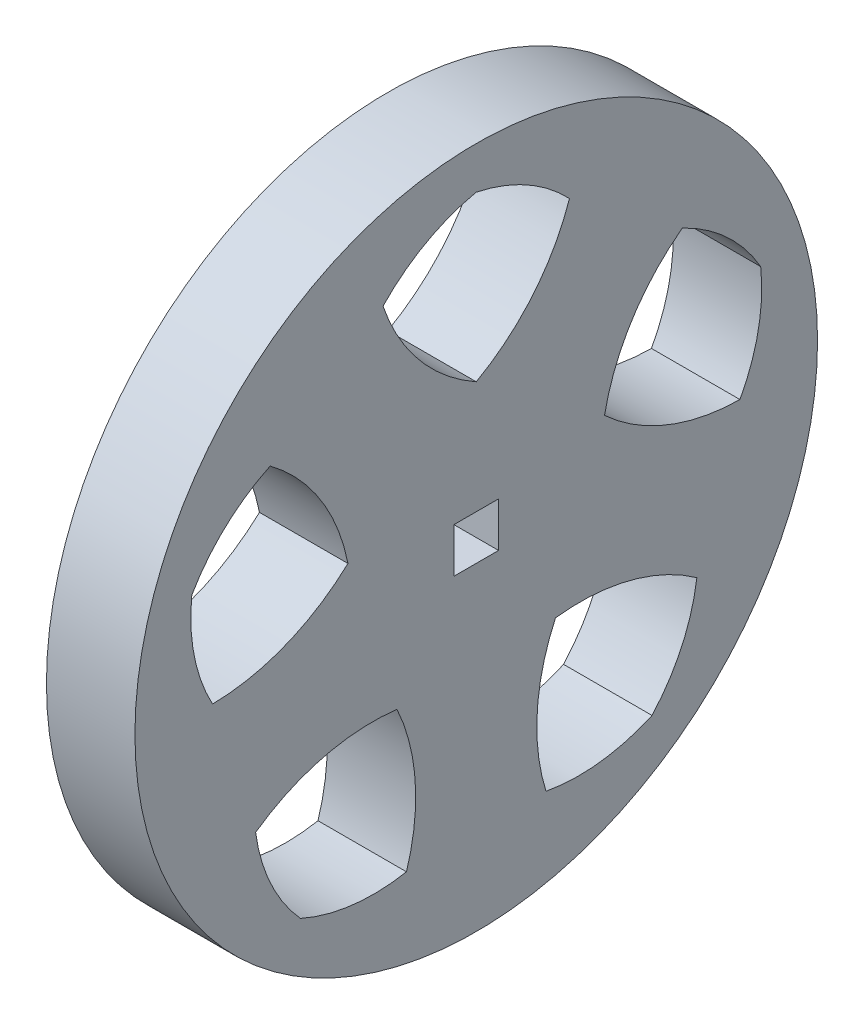
ISO-10303-21;
HEADER;
FILE_DESCRIPTION(('STEP AP214'),'2;1');
FILE_NAME('part.step','',(''),(''),'','','');
FILE_SCHEMA(('AUTOMOTIVE_DESIGN { 1 0 10303 214 1 1 1 1 }'));
ENDSEC;
DATA;
#1=APPLICATION_CONTEXT('core data for automotive mechanical design processes');
#2=APPLICATION_PROTOCOL_DEFINITION('international standard','automotive_design',2000,#1);
#3=PRODUCT_CONTEXT('',#1,'mechanical');
#4=PRODUCT('Part','Part','',(#3));
#5=PRODUCT_RELATED_PRODUCT_CATEGORY('part','',(#4));
#6=PRODUCT_DEFINITION_FORMATION('','',#4);
#7=PRODUCT_DEFINITION_CONTEXT('part definition',#1,'design');
#8=PRODUCT_DEFINITION('design','',#6,#7);
#9=PRODUCT_DEFINITION_SHAPE('','',#8);
#10=(LENGTH_UNIT() NAMED_UNIT(*) SI_UNIT(.MILLI.,.METRE.));
#11=(NAMED_UNIT(*) PLANE_ANGLE_UNIT() SI_UNIT($,.RADIAN.));
#12=(NAMED_UNIT(*) SI_UNIT($,.STERADIAN.) SOLID_ANGLE_UNIT());
#13=UNCERTAINTY_MEASURE_WITH_UNIT(LENGTH_MEASURE(1.E-05),#10,'distance_accuracy_value','');
#14=(GEOMETRIC_REPRESENTATION_CONTEXT(3) GLOBAL_UNCERTAINTY_ASSIGNED_CONTEXT((#13)) GLOBAL_UNIT_ASSIGNED_CONTEXT((#10,
#11,#12)) REPRESENTATION_CONTEXT('',''));
#15=CARTESIAN_POINT('',(0.,0.,0.));
#16=DIRECTION('',(0.,0.,1.));
#17=DIRECTION('',(1.,0.,0.));
#18=AXIS2_PLACEMENT_3D('',#15,#16,#17);
#19=CARTESIAN_POINT('',(3.5,0.,0.));
#20=DIRECTION('',(1.,0.,0.));
#21=DIRECTION('',(0.,0.,-1.));
#22=AXIS2_PLACEMENT_3D('',#19,#20,#21);
#23=PLANE('',#22);
#24=CARTESIAN_POINT('',(3.5,2.89803927268668,-4.20074499495832));
#25=DIRECTION('',(1.,0.,0.));
#26=DIRECTION('',(0.,0.,-1.));
#27=AXIS2_PLACEMENT_3D('',#24,#25,#26);
#28=CIRCLE('',#27,7.09033583026518);
#29=CARTESIAN_POINT('',(3.5,-0.488052953608528,-10.4302908548879));
#30=VERTEX_POINT('',#29);
#31=CARTESIAN_POINT('',(3.5,3.65551029172741,-11.2505038448237));
#32=VERTEX_POINT('',#31);
#33=EDGE_CURVE('E296',#30,#32,#28,.T.);
#34=ORIENTED_EDGE('',*,*,#33,.F.);
#35=CARTESIAN_POINT('',(3.5,7.52345649205795,-10.522001708562));
#36=DIRECTION('',(1.,0.,0.));
#37=DIRECTION('',(0.,0.,-1.));
#38=AXIS2_PLACEMENT_3D('',#35,#36,#37);
#39=CIRCLE('',#38,8.01203435331407);
#40=CARTESIAN_POINT('',(3.5,1.64867493717099,-5.07409971228442));
#41=VERTEX_POINT('',#40);
#42=EDGE_CURVE('E299',#41,#30,#39,.T.);
#43=ORIENTED_EDGE('',*,*,#42,.F.);
#44=CARTESIAN_POINT('',(3.5,0.0980732703738112,-12.9346549693646));
#45=DIRECTION('',(1.,0.,0.));
#46=DIRECTION('',(0.,0.,-1.));
#47=AXIS2_PLACEMENT_3D('',#44,#45,#46);
#48=CIRCLE('',#47,8.01203435331407);
#49=CARTESIAN_POINT('',(3.5,6.52561427524851,-8.15141222940886));
#50=VERTEX_POINT('',#49);
#51=EDGE_CURVE('E266',#50,#41,#48,.T.);
#52=ORIENTED_EDGE('',*,*,#51,.F.);
#53=CARTESIAN_POINT('',(3.5,0.124572934708498,-5.10189883500642));
#54=DIRECTION('',(1.,0.,0.));
#55=DIRECTION('',(0.,0.,-1.));
#56=AXIS2_PLACEMENT_3D('',#53,#54,#55);
#57=CIRCLE('',#56,7.09033583026518);
#58=EDGE_CURVE('E208',#32,#50,#57,.T.);
#59=ORIENTED_EDGE('',*,*,#58,.F.);
#60=EDGE_LOOP('',(#34,#43,#52,#59));
#61=FACE_BOUND('',#60,.T.);
#62=CARTESIAN_POINT('',(3.5,-3.09960251512318,-4.05430072724555));
#63=DIRECTION('',(1.,0.,0.));
#64=DIRECTION('',(0.,0.,-1.));
#65=AXIS2_PLACEMENT_3D('',#62,#63,#64);
#66=CIRCLE('',#65,7.09033583026518);
#67=CARTESIAN_POINT('',(3.5,-10.0706127412148,-2.75897118860744));
#68=VERTEX_POINT('',#67);
#69=CARTESIAN_POINT('',(3.5,-9.57025018996702,-6.95319376666255));
#70=VERTEX_POINT('',#69);
#71=EDGE_CURVE('E265',#68,#70,#66,.T.);
#72=ORIENTED_EDGE('',*,*,#71,.F.);
#73=CARTESIAN_POINT('',(3.5,-7.68214237691018,-10.4067096646226));
#74=DIRECTION('',(1.,0.,0.));
#75=DIRECTION('',(0.,0.,-1.));
#76=AXIS2_PLACEMENT_3D('',#73,#74,#75);
#77=CIRCLE('',#76,8.01203435331407);
#78=CARTESIAN_POINT('',(3.5,-4.31628702191358,-3.13596608449788));
#79=VERTEX_POINT('',#78);
#80=EDGE_CURVE('E269',#79,#68,#77,.T.);
#81=ORIENTED_EDGE('',*,*,#80,.F.);
#82=CARTESIAN_POINT('',(3.5,-12.2712815874042,-4.09030142477338));
#83=DIRECTION('',(1.,0.,0.));
#84=DIRECTION('',(0.,0.,-1.));
#85=AXIS2_PLACEMENT_3D('',#82,#83,#84);
#86=CIRCLE('',#85,8.01203435331407);
#87=CARTESIAN_POINT('',(3.5,-5.73592800799978,-8.72515288634688));
#88=VERTEX_POINT('',#87);
#89=EDGE_CURVE('E232',#88,#79,#86,.T.);
#90=ORIENTED_EDGE('',*,*,#89,.F.);
#91=CARTESIAN_POINT('',(3.5,-4.81369897864743,-1.69504934490725));
#92=DIRECTION('',(1.,0.,0.));
#93=DIRECTION('',(0.,0.,-1.));
#94=AXIS2_PLACEMENT_3D('',#91,#92,#93);
#95=CIRCLE('',#94,7.09033583026518);
#96=EDGE_CURVE('E263',#70,#88,#95,.T.);
#97=ORIENTED_EDGE('',*,*,#96,.F.);
#98=EDGE_LOOP('',(#72,#81,#90,#97));
#99=FACE_BOUND('',#98,.T.);
#100=CARTESIAN_POINT('',(3.5,-4.81369897864745,1.69504934490718));
#101=DIRECTION('',(1.,0.,0.));
#102=DIRECTION('',(0.,0.,-1.));
#103=AXIS2_PLACEMENT_3D('',#100,#101,#102);
#104=CIRCLE('',#103,7.09033583026518);
#105=CARTESIAN_POINT('',(3.5,-5.73592800799991,8.7251528863468));
#106=VERTEX_POINT('',#105);
#107=CARTESIAN_POINT('',(3.5,-9.57025018996712,6.95319376666241));
#108=VERTEX_POINT('',#107);
#109=EDGE_CURVE('E231',#106,#108,#104,.T.);
#110=ORIENTED_EDGE('',*,*,#109,.F.);
#111=CARTESIAN_POINT('',(3.5,-12.2712815874043,4.0903014247732));
#112=DIRECTION('',(1.,0.,0.));
#113=DIRECTION('',(0.,0.,-1.));
#114=AXIS2_PLACEMENT_3D('',#111,#112,#113);
#115=CIRCLE('',#114,8.01203435331407);
#116=CARTESIAN_POINT('',(3.5,-4.31628702191363,3.13596608449782));
#117=VERTEX_POINT('',#116);
#118=EDGE_CURVE('E235',#117,#106,#115,.T.);
#119=ORIENTED_EDGE('',*,*,#118,.F.);
#120=CARTESIAN_POINT('',(3.5,-7.68214237691033,10.4067096646225));
#121=DIRECTION('',(1.,0.,0.));
#122=DIRECTION('',(0.,0.,-1.));
#123=AXIS2_PLACEMENT_3D('',#120,#121,#122);
#124=CIRCLE('',#123,8.01203435331407);
#125=CARTESIAN_POINT('',(3.5,-10.0706127412148,2.75897118860729));
#126=VERTEX_POINT('',#125);
#127=EDGE_CURVE('E259',#126,#117,#124,.T.);
#128=ORIENTED_EDGE('',*,*,#127,.F.);
#129=CARTESIAN_POINT('',(3.5,-3.09960251512324,4.05430072724551));
#130=DIRECTION('',(1.,0.,0.));
#131=DIRECTION('',(0.,0.,-1.));
#132=AXIS2_PLACEMENT_3D('',#129,#130,#131);
#133=CIRCLE('',#132,7.09033583026518);
#134=EDGE_CURVE('E229',#108,#126,#133,.T.);
#135=ORIENTED_EDGE('',*,*,#134,.F.);
#136=EDGE_LOOP('',(#110,#119,#128,#135));
#137=FACE_BOUND('',#136,.T.);
#138=CARTESIAN_POINT('',(3.5,0.124572934708426,5.10189883500643));
#139=DIRECTION('',(1.,0.,0.));
#140=DIRECTION('',(0.,0.,-1.));
#141=AXIS2_PLACEMENT_3D('',#138,#139,#140);
#142=CIRCLE('',#141,7.09033583026518);
#143=CARTESIAN_POINT('',(3.5,6.5256142752484,8.15141222940896));
#144=VERTEX_POINT('',#143);
#145=CARTESIAN_POINT('',(3.5,3.65551029172725,11.2505038448238));
#146=VERTEX_POINT('',#145);
#147=EDGE_CURVE('E326',#144,#146,#142,.T.);
#148=ORIENTED_EDGE('',*,*,#147,.F.);
#149=CARTESIAN_POINT('',(3.5,0.0980732703736277,12.9346549693646));
#150=DIRECTION('',(1.,0.,0.));
#151=DIRECTION('',(0.,0.,-1.));
#152=AXIS2_PLACEMENT_3D('',#149,#150,#151);
#153=CIRCLE('',#152,8.01203435331407);
#154=CARTESIAN_POINT('',(3.5,1.64867493717092,5.07409971228444));
#155=VERTEX_POINT('',#154);
#156=EDGE_CURVE('E329',#155,#144,#153,.T.);
#157=ORIENTED_EDGE('',*,*,#156,.F.);
#158=CARTESIAN_POINT('',(3.5,7.5234564920578,10.5220017085621));
#159=DIRECTION('',(1.,0.,0.));
#160=DIRECTION('',(0.,0.,-1.));
#161=AXIS2_PLACEMENT_3D('',#158,#159,#160);
#162=CIRCLE('',#161,8.01203435331407);
#163=CARTESIAN_POINT('',(3.5,-0.488052953608675,10.4302908548879));
#164=VERTEX_POINT('',#163);
#165=EDGE_CURVE('E353',#164,#155,#162,.T.);
#166=ORIENTED_EDGE('',*,*,#165,.F.);
#167=CARTESIAN_POINT('',(3.5,2.89803927268662,4.20074499495837));
#168=DIRECTION('',(1.,0.,0.));
#169=DIRECTION('',(0.,0.,-1.));
#170=AXIS2_PLACEMENT_3D('',#167,#168,#169);
#171=CIRCLE('',#170,7.09033583026518);
#172=EDGE_CURVE('E262',#146,#164,#171,.T.);
#173=ORIENTED_EDGE('',*,*,#172,.F.);
#174=EDGE_LOOP('',(#148,#157,#166,#173));
#175=FACE_BOUND('',#174,.T.);
#176=CARTESIAN_POINT('',(3.5,4.89068928637558,1.45809754229026));
#177=DIRECTION('',(1.,0.,0.));
#178=DIRECTION('',(0.,0.,-1.));
#179=AXIS2_PLACEMENT_3D('',#176,#177,#178);
#180=CIRCLE('',#179,7.09033583026518);
#181=CARTESIAN_POINT('',(3.5,9.7689794275749,-3.68730307226055));
#182=VERTEX_POINT('',#181);
#183=CARTESIAN_POINT('',(3.5,11.8294797964796,0.));
#184=VERTEX_POINT('',#183);
#185=EDGE_CURVE('E358',#182,#184,#180,.T.);
#186=ORIENTED_EDGE('',*,*,#185,.F.);
#187=CARTESIAN_POINT('',(3.5,12.3318942018831,3.90375497904677));
#188=DIRECTION('',(1.,0.,0.));
#189=DIRECTION('',(0.,0.,-1.));
#190=AXIS2_PLACEMENT_3D('',#187,#188,#189);
#191=CIRCLE('',#190,8.01203435331407);
#192=CARTESIAN_POINT('',(3.5,5.33522416948534,0.));
#193=VERTEX_POINT('',#192);
#194=EDGE_CURVE('E361',#193,#182,#191,.T.);
#195=ORIENTED_EDGE('',*,*,#194,.F.);
#196=CARTESIAN_POINT('',(3.5,12.3318942018831,-3.90375497904677));
#197=DIRECTION('',(1.,0.,0.));
#198=DIRECTION('',(0.,0.,-1.));
#199=AXIS2_PLACEMENT_3D('',#196,#197,#198);
#200=CIRCLE('',#199,8.01203435331407);
#201=CARTESIAN_POINT('',(3.5,9.76897942757489,3.68730307226055));
#202=VERTEX_POINT('',#201);
#203=EDGE_CURVE('E385',#202,#193,#200,.T.);
#204=ORIENTED_EDGE('',*,*,#203,.F.);
#205=CARTESIAN_POINT('',(3.5,4.89068928637558,-1.45809754229026));
#206=DIRECTION('',(1.,0.,0.));
#207=DIRECTION('',(0.,0.,-1.));
#208=AXIS2_PLACEMENT_3D('',#205,#206,#207);
#209=CIRCLE('',#208,7.09033583026518);
#210=EDGE_CURVE('E356',#184,#202,#209,.T.);
#211=ORIENTED_EDGE('',*,*,#210,.F.);
#212=EDGE_LOOP('',(#186,#195,#204,#211));
#213=FACE_BOUND('',#212,.T.);
#214=CARTESIAN_POINT('',(3.5,0.,0.));
#215=DIRECTION('',(1.,0.,0.));
#216=DIRECTION('',(0.,0.,-1.));
#217=AXIS2_PLACEMENT_3D('',#214,#215,#216);
#218=CIRCLE('',#217,13.5);
#219=CARTESIAN_POINT('',(3.5,0.,-13.5));
#220=VERTEX_POINT('',#219);
#221=EDGE_CURVE('E11',#220,#220,#218,.T.);
#222=ORIENTED_EDGE('',*,*,#221,.T.);
#223=EDGE_LOOP('',(#222));
#224=FACE_BOUND('',#223,.T.);
#225=DIRECTION('',(0.,0.,-1.));
#226=VECTOR('',#225,1.);
#227=CARTESIAN_POINT('',(3.5,-0.883883476483185,-0.883883476483188));
#228=LINE('',#227,#226);
#229=CARTESIAN_POINT('',(3.5,-0.883883476483186,0.883883476483182));
#230=VERTEX_POINT('',#229);
#231=CARTESIAN_POINT('',(3.5,-0.883883476483185,-0.883883476483188));
#232=VERTEX_POINT('',#231);
#233=EDGE_CURVE('E212',#230,#232,#228,.T.);
#234=ORIENTED_EDGE('',*,*,#233,.F.);
#235=DIRECTION('',(0.,-1.,0.));
#236=VECTOR('',#235,1.);
#237=CARTESIAN_POINT('',(3.5,-0.883883476483186,0.883883476483182));
#238=LINE('',#237,#236);
#239=CARTESIAN_POINT('',(3.5,0.883883476483184,0.883883476483182));
#240=VERTEX_POINT('',#239);
#241=EDGE_CURVE('E196',#240,#230,#238,.T.);
#242=ORIENTED_EDGE('',*,*,#241,.F.);
#243=DIRECTION('',(0.,0.,1.));
#244=VECTOR('',#243,1.);
#245=CARTESIAN_POINT('',(3.5,0.883883476483184,-0.883883476483187));
#246=LINE('',#245,#244);
#247=CARTESIAN_POINT('',(3.5,0.883883476483184,-0.883883476483187));
#248=VERTEX_POINT('',#247);
#249=EDGE_CURVE('E205',#248,#240,#246,.T.);
#250=ORIENTED_EDGE('',*,*,#249,.F.);
#251=DIRECTION('',(0.,1.,0.));
#252=VECTOR('',#251,1.);
#253=CARTESIAN_POINT('',(3.5,-0.883883476483185,-0.883883476483188));
#254=LINE('',#253,#252);
#255=EDGE_CURVE('E48',#232,#248,#254,.T.);
#256=ORIENTED_EDGE('',*,*,#255,.F.);
#257=EDGE_LOOP('',(#234,#242,#250,#256));
#258=FACE_BOUND('',#257,.T.);
#259=ADVANCED_FACE('F33',(#61,#99,#137,#175,#213,#224,#258),#23,.T.);
#260=CARTESIAN_POINT('',(0.,0.,0.));
#261=DIRECTION('',(1.,0.,0.));
#262=DIRECTION('',(0.,0.,-1.));
#263=AXIS2_PLACEMENT_3D('',#260,#261,#262);
#264=PLANE('',#263);
#265=CARTESIAN_POINT('',(0.,0.,0.));
#266=DIRECTION('',(1.,0.,0.));
#267=DIRECTION('',(0.,0.,-1.));
#268=AXIS2_PLACEMENT_3D('',#265,#266,#267);
#269=CIRCLE('',#268,13.5);
#270=CARTESIAN_POINT('',(0.,0.,-13.5));
#271=VERTEX_POINT('',#270);
#272=EDGE_CURVE('E37',#271,#271,#269,.T.);
#273=ORIENTED_EDGE('',*,*,#272,.F.);
#274=EDGE_LOOP('',(#273));
#275=FACE_BOUND('',#274,.T.);
#276=CARTESIAN_POINT('',(0.,12.3318942018831,3.90375497904677));
#277=DIRECTION('',(1.,0.,0.));
#278=DIRECTION('',(0.,0.,-1.));
#279=AXIS2_PLACEMENT_3D('',#276,#277,#278);
#280=CIRCLE('',#279,8.01203435331407);
#281=CARTESIAN_POINT('',(0.,5.33522416948534,0.));
#282=VERTEX_POINT('',#281);
#283=CARTESIAN_POINT('',(0.,9.7689794275749,-3.68730307226055));
#284=VERTEX_POINT('',#283);
#285=EDGE_CURVE('E364',#282,#284,#280,.T.);
#286=ORIENTED_EDGE('',*,*,#285,.T.);
#287=CARTESIAN_POINT('',(0.,4.89068928637558,1.45809754229026));
#288=DIRECTION('',(1.,0.,0.));
#289=DIRECTION('',(0.,0.,-1.));
#290=AXIS2_PLACEMENT_3D('',#287,#288,#289);
#291=CIRCLE('',#290,7.09033583026518);
#292=CARTESIAN_POINT('',(0.,11.8294797964796,0.));
#293=VERTEX_POINT('',#292);
#294=EDGE_CURVE('E367',#284,#293,#291,.T.);
#295=ORIENTED_EDGE('',*,*,#294,.T.);
#296=CARTESIAN_POINT('',(0.,4.89068928637558,-1.45809754229026));
#297=DIRECTION('',(1.,0.,0.));
#298=DIRECTION('',(0.,0.,1.));
#299=AXIS2_PLACEMENT_3D('',#296,#297,#298);
#300=CIRCLE('',#299,7.09033583026518);
#301=CARTESIAN_POINT('',(0.,9.76897942757489,3.68730307226055));
#302=VERTEX_POINT('',#301);
#303=EDGE_CURVE('E370',#293,#302,#300,.T.);
#304=ORIENTED_EDGE('',*,*,#303,.T.);
#305=CARTESIAN_POINT('',(0.,12.3318942018831,-3.90375497904677));
#306=DIRECTION('',(1.,0.,0.));
#307=DIRECTION('',(0.,0.,1.));
#308=AXIS2_PLACEMENT_3D('',#305,#306,#307);
#309=CIRCLE('',#308,8.01203435331407);
#310=EDGE_CURVE('E373',#302,#282,#309,.T.);
#311=ORIENTED_EDGE('',*,*,#310,.T.);
#312=EDGE_LOOP('',(#286,#295,#304,#311));
#313=FACE_BOUND('',#312,.T.);
#314=CARTESIAN_POINT('',(0.,0.0980732703736277,12.9346549693646));
#315=DIRECTION('',(1.,0.,0.));
#316=DIRECTION('',(0.,0.951056516295155,-0.309016994374945));
#317=AXIS2_PLACEMENT_3D('',#314,#315,#316);
#318=CIRCLE('',#317,8.01203435331407);
#319=CARTESIAN_POINT('',(0.,1.64867493717092,5.07409971228444));
#320=VERTEX_POINT('',#319);
#321=CARTESIAN_POINT('',(0.,6.5256142752484,8.15141222940896));
#322=VERTEX_POINT('',#321);
#323=EDGE_CURVE('E332',#320,#322,#318,.T.);
#324=ORIENTED_EDGE('',*,*,#323,.T.);
#325=CARTESIAN_POINT('',(0.,0.124572934708426,5.10189883500643));
#326=DIRECTION('',(1.,0.,0.));
#327=DIRECTION('',(0.,0.951056516295155,-0.309016994374945));
#328=AXIS2_PLACEMENT_3D('',#325,#326,#327);
#329=CIRCLE('',#328,7.09033583026518);
#330=CARTESIAN_POINT('',(0.,3.65551029172725,11.2505038448238));
#331=VERTEX_POINT('',#330);
#332=EDGE_CURVE('E335',#322,#331,#329,.T.);
#333=ORIENTED_EDGE('',*,*,#332,.T.);
#334=CARTESIAN_POINT('',(0.,2.89803927268662,4.20074499495837));
#335=DIRECTION('',(1.,0.,0.));
#336=DIRECTION('',(0.,-0.951056516295155,0.309016994374945));
#337=AXIS2_PLACEMENT_3D('',#334,#335,#336);
#338=CIRCLE('',#337,7.09033583026518);
#339=CARTESIAN_POINT('',(0.,-0.488052953608676,10.4302908548879));
#340=VERTEX_POINT('',#339);
#341=EDGE_CURVE('E338',#331,#340,#338,.T.);
#342=ORIENTED_EDGE('',*,*,#341,.T.);
#343=CARTESIAN_POINT('',(0.,7.5234564920578,10.5220017085621));
#344=DIRECTION('',(1.,0.,0.));
#345=DIRECTION('',(0.,-0.951056516295155,0.309016994374945));
#346=AXIS2_PLACEMENT_3D('',#343,#344,#345);
#347=CIRCLE('',#346,8.01203435331407);
#348=EDGE_CURVE('E341',#340,#320,#347,.T.);
#349=ORIENTED_EDGE('',*,*,#348,.T.);
#350=EDGE_LOOP('',(#324,#333,#342,#349));
#351=FACE_BOUND('',#350,.T.);
#352=CARTESIAN_POINT('',(0.,-12.2712815874043,4.0903014247732));
#353=DIRECTION('',(1.,0.,0.));
#354=DIRECTION('',(0.,0.587785252292469,0.809016994374951));
#355=AXIS2_PLACEMENT_3D('',#352,#353,#354);
#356=CIRCLE('',#355,8.01203435331407);
#357=CARTESIAN_POINT('',(0.,-4.31628702191363,3.13596608449782));
#358=VERTEX_POINT('',#357);
#359=CARTESIAN_POINT('',(0.,-5.73592800799991,8.7251528863468));
#360=VERTEX_POINT('',#359);
#361=EDGE_CURVE('E238',#358,#360,#356,.T.);
#362=ORIENTED_EDGE('',*,*,#361,.T.);
#363=CARTESIAN_POINT('',(0.,-4.81369897864745,1.69504934490718));
#364=DIRECTION('',(1.,0.,0.));
#365=DIRECTION('',(0.,0.587785252292469,0.809016994374951));
#366=AXIS2_PLACEMENT_3D('',#363,#364,#365);
#367=CIRCLE('',#366,7.09033583026518);
#368=CARTESIAN_POINT('',(0.,-9.57025018996712,6.95319376666241));
#369=VERTEX_POINT('',#368);
#370=EDGE_CURVE('E241',#360,#369,#367,.T.);
#371=ORIENTED_EDGE('',*,*,#370,.T.);
#372=CARTESIAN_POINT('',(0.,-3.09960251512324,4.05430072724551));
#373=DIRECTION('',(1.,0.,0.));
#374=DIRECTION('',(0.,-0.587785252292469,-0.809016994374951));
#375=AXIS2_PLACEMENT_3D('',#372,#373,#374);
#376=CIRCLE('',#375,7.09033583026518);
#377=CARTESIAN_POINT('',(0.,-10.0706127412148,2.75897118860729));
#378=VERTEX_POINT('',#377);
#379=EDGE_CURVE('E244',#369,#378,#376,.T.);
#380=ORIENTED_EDGE('',*,*,#379,.T.);
#381=CARTESIAN_POINT('',(0.,-7.68214237691033,10.4067096646225));
#382=DIRECTION('',(1.,0.,0.));
#383=DIRECTION('',(0.,-0.587785252292469,-0.809016994374951));
#384=AXIS2_PLACEMENT_3D('',#381,#382,#383);
#385=CIRCLE('',#384,8.01203435331407);
#386=EDGE_CURVE('E247',#378,#358,#385,.T.);
#387=ORIENTED_EDGE('',*,*,#386,.T.);
#388=EDGE_LOOP('',(#362,#371,#380,#387));
#389=FACE_BOUND('',#388,.T.);
#390=CARTESIAN_POINT('',(0.,-7.68214237691018,-10.4067096646226));
#391=DIRECTION('',(1.,0.,0.));
#392=DIRECTION('',(0.,-0.58778525229248,0.809016994374942));
#393=AXIS2_PLACEMENT_3D('',#390,#391,#392);
#394=CIRCLE('',#393,8.01203435331407);
#395=CARTESIAN_POINT('',(0.,-4.31628702191358,-3.13596608449788));
#396=VERTEX_POINT('',#395);
#397=CARTESIAN_POINT('',(0.,-10.0706127412148,-2.75897118860744));
#398=VERTEX_POINT('',#397);
#399=EDGE_CURVE('E272',#396,#398,#394,.T.);
#400=ORIENTED_EDGE('',*,*,#399,.T.);
#401=CARTESIAN_POINT('',(0.,-3.09960251512318,-4.05430072724555));
#402=DIRECTION('',(1.,0.,0.));
#403=DIRECTION('',(0.,-0.58778525229248,0.809016994374942));
#404=AXIS2_PLACEMENT_3D('',#401,#402,#403);
#405=CIRCLE('',#404,7.09033583026518);
#406=CARTESIAN_POINT('',(0.,-9.57025018996702,-6.95319376666255));
#407=VERTEX_POINT('',#406);
#408=EDGE_CURVE('E275',#398,#407,#405,.T.);
#409=ORIENTED_EDGE('',*,*,#408,.T.);
#410=CARTESIAN_POINT('',(0.,-4.81369897864743,-1.69504934490725));
#411=DIRECTION('',(1.,0.,0.));
#412=DIRECTION('',(0.,0.58778525229248,-0.809016994374942));
#413=AXIS2_PLACEMENT_3D('',#410,#411,#412);
#414=CIRCLE('',#413,7.09033583026518);
#415=CARTESIAN_POINT('',(0.,-5.73592800799978,-8.72515288634688));
#416=VERTEX_POINT('',#415);
#417=EDGE_CURVE('E278',#407,#416,#414,.T.);
#418=ORIENTED_EDGE('',*,*,#417,.T.);
#419=CARTESIAN_POINT('',(0.,-12.2712815874042,-4.09030142477338));
#420=DIRECTION('',(1.,0.,0.));
#421=DIRECTION('',(0.,0.58778525229248,-0.809016994374942));
#422=AXIS2_PLACEMENT_3D('',#419,#420,#421);
#423=CIRCLE('',#422,8.01203435331407);
#424=EDGE_CURVE('E281',#416,#396,#423,.T.);
#425=ORIENTED_EDGE('',*,*,#424,.T.);
#426=EDGE_LOOP('',(#400,#409,#418,#425));
#427=FACE_BOUND('',#426,.T.);
#428=CARTESIAN_POINT('',(0.,7.52345649205795,-10.522001708562));
#429=DIRECTION('',(1.,0.,0.));
#430=DIRECTION('',(0.,-0.95105651629515,-0.309016994374958));
#431=AXIS2_PLACEMENT_3D('',#428,#429,#430);
#432=CIRCLE('',#431,8.01203435331407);
#433=CARTESIAN_POINT('',(0.,1.64867493717099,-5.07409971228442));
#434=VERTEX_POINT('',#433);
#435=CARTESIAN_POINT('',(0.,-0.488052953608528,-10.4302908548879));
#436=VERTEX_POINT('',#435);
#437=EDGE_CURVE('E302',#434,#436,#432,.T.);
#438=ORIENTED_EDGE('',*,*,#437,.T.);
#439=CARTESIAN_POINT('',(0.,2.89803927268668,-4.20074499495832));
#440=DIRECTION('',(1.,0.,0.));
#441=DIRECTION('',(0.,-0.95105651629515,-0.309016994374958));
#442=AXIS2_PLACEMENT_3D('',#439,#440,#441);
#443=CIRCLE('',#442,7.09033583026518);
#444=CARTESIAN_POINT('',(0.,3.65551029172741,-11.2505038448237));
#445=VERTEX_POINT('',#444);
#446=EDGE_CURVE('E305',#436,#445,#443,.T.);
#447=ORIENTED_EDGE('',*,*,#446,.T.);
#448=CARTESIAN_POINT('',(0.,0.124572934708498,-5.10189883500642));
#449=DIRECTION('',(1.,0.,0.));
#450=DIRECTION('',(0.,0.95105651629515,0.309016994374958));
#451=AXIS2_PLACEMENT_3D('',#448,#449,#450);
#452=CIRCLE('',#451,7.09033583026518);
#453=CARTESIAN_POINT('',(0.,6.52561427524851,-8.15141222940886));
#454=VERTEX_POINT('',#453);
#455=EDGE_CURVE('E308',#445,#454,#452,.T.);
#456=ORIENTED_EDGE('',*,*,#455,.T.);
#457=CARTESIAN_POINT('',(0.,0.0980732703738112,-12.9346549693646));
#458=DIRECTION('',(1.,0.,0.));
#459=DIRECTION('',(0.,0.95105651629515,0.309016994374958));
#460=AXIS2_PLACEMENT_3D('',#457,#458,#459);
#461=CIRCLE('',#460,8.01203435331407);
#462=EDGE_CURVE('E311',#454,#434,#461,.T.);
#463=ORIENTED_EDGE('',*,*,#462,.T.);
#464=EDGE_LOOP('',(#438,#447,#456,#463));
#465=FACE_BOUND('',#464,.T.);
#466=DIRECTION('',(0.,-1.,0.));
#467=VECTOR('',#466,1.);
#468=CARTESIAN_POINT('',(0.,-0.883883476483186,0.883883476483182));
#469=LINE('',#468,#467);
#470=CARTESIAN_POINT('',(0.,0.883883476483184,0.883883476483182));
#471=VERTEX_POINT('',#470);
#472=CARTESIAN_POINT('',(0.,-0.883883476483186,0.883883476483182));
#473=VERTEX_POINT('',#472);
#474=EDGE_CURVE('E56',#471,#473,#469,.T.);
#475=ORIENTED_EDGE('',*,*,#474,.T.);
#476=DIRECTION('',(0.,0.,-1.));
#477=VECTOR('',#476,1.);
#478=CARTESIAN_POINT('',(0.,-0.883883476483185,-0.883883476483188));
#479=LINE('',#478,#477);
#480=CARTESIAN_POINT('',(0.,-0.883883476483185,-0.883883476483188));
#481=VERTEX_POINT('',#480);
#482=EDGE_CURVE('E214',#473,#481,#479,.T.);
#483=ORIENTED_EDGE('',*,*,#482,.T.);
#484=DIRECTION('',(0.,1.,0.));
#485=VECTOR('',#484,1.);
#486=CARTESIAN_POINT('',(0.,-0.883883476483185,-0.883883476483188));
#487=LINE('',#486,#485);
#488=CARTESIAN_POINT('',(0.,0.883883476483184,-0.883883476483187));
#489=VERTEX_POINT('',#488);
#490=EDGE_CURVE('E221',#481,#489,#487,.T.);
#491=ORIENTED_EDGE('',*,*,#490,.T.);
#492=DIRECTION('',(0.,0.,1.));
#493=VECTOR('',#492,1.);
#494=CARTESIAN_POINT('',(0.,0.883883476483184,-0.883883476483187));
#495=LINE('',#494,#493);
#496=EDGE_CURVE('E202',#489,#471,#495,.T.);
#497=ORIENTED_EDGE('',*,*,#496,.T.);
#498=EDGE_LOOP('',(#475,#483,#491,#497));
#499=FACE_BOUND('',#498,.T.);
#500=ADVANCED_FACE('F395',(#275,#313,#351,#389,#427,#465,#499),#264,.F.);
#501=CARTESIAN_POINT('',(3.5,0.,0.));
#502=DIRECTION('',(-1.,0.,0.));
#503=DIRECTION('',(0.,0.,1.));
#504=AXIS2_PLACEMENT_3D('',#501,#502,#503);
#505=CYLINDRICAL_SURFACE('',#504,13.5);
#506=ORIENTED_EDGE('',*,*,#221,.F.);
#507=EDGE_LOOP('',(#506));
#508=FACE_BOUND('',#507,.T.);
#509=ORIENTED_EDGE('',*,*,#272,.T.);
#510=EDGE_LOOP('',(#509));
#511=FACE_BOUND('',#510,.T.);
#512=ADVANCED_FACE('F35',(#508,#511),#505,.T.);
#513=CARTESIAN_POINT('',(3.501,12.3318942018831,3.90375497904677));
#514=DIRECTION('',(-1.,0.,0.));
#515=DIRECTION('',(0.,0.,1.));
#516=AXIS2_PLACEMENT_3D('',#513,#514,#515);
#517=CYLINDRICAL_SURFACE('',#516,8.01203435331407);
#518=ORIENTED_EDGE('',*,*,#194,.T.);
#519=DIRECTION('',(-1.,0.,0.));
#520=VECTOR('',#519,1.);
#521=CARTESIAN_POINT('',(3.501,9.7689794275749,-3.68730307226055));
#522=LINE('',#521,#520);
#523=EDGE_CURVE('E383',#182,#284,#522,.T.);
#524=ORIENTED_EDGE('',*,*,#523,.T.);
#525=ORIENTED_EDGE('',*,*,#285,.F.);
#526=DIRECTION('',(-1.,0.,0.));
#527=VECTOR('',#526,1.);
#528=CARTESIAN_POINT('',(3.501,5.33522416948534,0.));
#529=LINE('',#528,#527);
#530=EDGE_CURVE('E376',#193,#282,#529,.T.);
#531=ORIENTED_EDGE('',*,*,#530,.F.);
#532=EDGE_LOOP('',(#518,#524,#525,#531));
#533=FACE_BOUND('',#532,.T.);
#534=ADVANCED_FACE('F425',(#533),#517,.F.);
#535=CARTESIAN_POINT('',(3.501,4.89068928637558,1.45809754229026));
#536=DIRECTION('',(-1.,0.,0.));
#537=DIRECTION('',(0.,0.,1.));
#538=AXIS2_PLACEMENT_3D('',#535,#536,#537);
#539=CYLINDRICAL_SURFACE('',#538,7.09033583026518);
#540=ORIENTED_EDGE('',*,*,#185,.T.);
#541=DIRECTION('',(-1.,0.,0.));
#542=VECTOR('',#541,1.);
#543=CARTESIAN_POINT('',(3.501,11.8294797964796,0.));
#544=LINE('',#543,#542);
#545=EDGE_CURVE('E381',#184,#293,#544,.T.);
#546=ORIENTED_EDGE('',*,*,#545,.T.);
#547=ORIENTED_EDGE('',*,*,#294,.F.);
#548=ORIENTED_EDGE('',*,*,#523,.F.);
#549=EDGE_LOOP('',(#540,#546,#547,#548));
#550=FACE_BOUND('',#549,.T.);
#551=ADVANCED_FACE('F428',(#550),#539,.F.);
#552=CARTESIAN_POINT('',(3.501,4.89068928637558,-1.45809754229026));
#553=DIRECTION('',(-1.,0.,0.));
#554=DIRECTION('',(0.,0.,1.));
#555=AXIS2_PLACEMENT_3D('',#552,#553,#554);
#556=CYLINDRICAL_SURFACE('',#555,7.09033583026518);
#557=ORIENTED_EDGE('',*,*,#210,.T.);
#558=DIRECTION('',(-1.,0.,0.));
#559=VECTOR('',#558,1.);
#560=CARTESIAN_POINT('',(3.501,9.76897942757489,3.68730307226055));
#561=LINE('',#560,#559);
#562=EDGE_CURVE('E379',#202,#302,#561,.T.);
#563=ORIENTED_EDGE('',*,*,#562,.T.);
#564=ORIENTED_EDGE('',*,*,#303,.F.);
#565=ORIENTED_EDGE('',*,*,#545,.F.);
#566=EDGE_LOOP('',(#557,#563,#564,#565));
#567=FACE_BOUND('',#566,.T.);
#568=ADVANCED_FACE('F432',(#567),#556,.F.);
#569=CARTESIAN_POINT('',(3.501,12.3318942018831,-3.90375497904677));
#570=DIRECTION('',(-1.,0.,0.));
#571=DIRECTION('',(0.,0.,1.));
#572=AXIS2_PLACEMENT_3D('',#569,#570,#571);
#573=CYLINDRICAL_SURFACE('',#572,8.01203435331407);
#574=ORIENTED_EDGE('',*,*,#203,.T.);
#575=ORIENTED_EDGE('',*,*,#530,.T.);
#576=ORIENTED_EDGE('',*,*,#310,.F.);
#577=ORIENTED_EDGE('',*,*,#562,.F.);
#578=EDGE_LOOP('',(#574,#575,#576,#577));
#579=FACE_BOUND('',#578,.T.);
#580=ADVANCED_FACE('F436',(#579),#573,.F.);
#581=CARTESIAN_POINT('',(3.501,0.0980732703736277,12.9346549693646));
#582=DIRECTION('',(-1.,0.,0.));
#583=DIRECTION('',(0.,0.,1.));
#584=AXIS2_PLACEMENT_3D('',#581,#582,#583);
#585=CYLINDRICAL_SURFACE('',#584,8.01203435331407);
#586=ORIENTED_EDGE('',*,*,#156,.T.);
#587=DIRECTION('',(-1.,0.,0.));
#588=VECTOR('',#587,1.);
#589=CARTESIAN_POINT('',(3.501,6.5256142752484,8.15141222940896));
#590=LINE('',#589,#588);
#591=EDGE_CURVE('E351',#144,#322,#590,.T.);
#592=ORIENTED_EDGE('',*,*,#591,.T.);
#593=ORIENTED_EDGE('',*,*,#323,.F.);
#594=DIRECTION('',(-1.,0.,0.));
#595=VECTOR('',#594,1.);
#596=CARTESIAN_POINT('',(3.501,1.64867493717092,5.07409971228444));
#597=LINE('',#596,#595);
#598=EDGE_CURVE('E344',#155,#320,#597,.T.);
#599=ORIENTED_EDGE('',*,*,#598,.F.);
#600=EDGE_LOOP('',(#586,#592,#593,#599));
#601=FACE_BOUND('',#600,.T.);
#602=ADVANCED_FACE('F440',(#601),#585,.F.);
#603=CARTESIAN_POINT('',(3.501,0.124572934708426,5.10189883500643));
#604=DIRECTION('',(-1.,0.,0.));
#605=DIRECTION('',(0.,0.,1.));
#606=AXIS2_PLACEMENT_3D('',#603,#604,#605);
#607=CYLINDRICAL_SURFACE('',#606,7.09033583026518);
#608=ORIENTED_EDGE('',*,*,#147,.T.);
#609=DIRECTION('',(-1.,0.,0.));
#610=VECTOR('',#609,1.);
#611=CARTESIAN_POINT('',(3.501,3.65551029172725,11.2505038448238));
#612=LINE('',#611,#610);
#613=EDGE_CURVE('E349',#146,#331,#612,.T.);
#614=ORIENTED_EDGE('',*,*,#613,.T.);
#615=ORIENTED_EDGE('',*,*,#332,.F.);
#616=ORIENTED_EDGE('',*,*,#591,.F.);
#617=EDGE_LOOP('',(#608,#614,#615,#616));
#618=FACE_BOUND('',#617,.T.);
#619=ADVANCED_FACE('F443',(#618),#607,.F.);
#620=CARTESIAN_POINT('',(3.501,2.89803927268662,4.20074499495837));
#621=DIRECTION('',(-1.,0.,0.));
#622=DIRECTION('',(0.,0.,1.));
#623=AXIS2_PLACEMENT_3D('',#620,#621,#622);
#624=CYLINDRICAL_SURFACE('',#623,7.09033583026518);
#625=ORIENTED_EDGE('',*,*,#172,.T.);
#626=DIRECTION('',(-1.,0.,0.));
#627=VECTOR('',#626,1.);
#628=CARTESIAN_POINT('',(3.501,-0.488052953608676,10.4302908548879));
#629=LINE('',#628,#627);
#630=EDGE_CURVE('E347',#164,#340,#629,.T.);
#631=ORIENTED_EDGE('',*,*,#630,.T.);
#632=ORIENTED_EDGE('',*,*,#341,.F.);
#633=ORIENTED_EDGE('',*,*,#613,.F.);
#634=EDGE_LOOP('',(#625,#631,#632,#633));
#635=FACE_BOUND('',#634,.T.);
#636=ADVANCED_FACE('F447',(#635),#624,.F.);
#637=CARTESIAN_POINT('',(3.501,7.5234564920578,10.5220017085621));
#638=DIRECTION('',(-1.,0.,0.));
#639=DIRECTION('',(0.,0.,1.));
#640=AXIS2_PLACEMENT_3D('',#637,#638,#639);
#641=CYLINDRICAL_SURFACE('',#640,8.01203435331407);
#642=ORIENTED_EDGE('',*,*,#165,.T.);
#643=ORIENTED_EDGE('',*,*,#598,.T.);
#644=ORIENTED_EDGE('',*,*,#348,.F.);
#645=ORIENTED_EDGE('',*,*,#630,.F.);
#646=EDGE_LOOP('',(#642,#643,#644,#645));
#647=FACE_BOUND('',#646,.T.);
#648=ADVANCED_FACE('F451',(#647),#641,.F.);
#649=CARTESIAN_POINT('',(3.501,-12.2712815874043,4.0903014247732));
#650=DIRECTION('',(-1.,0.,0.));
#651=DIRECTION('',(0.,0.,1.));
#652=AXIS2_PLACEMENT_3D('',#649,#650,#651);
#653=CYLINDRICAL_SURFACE('',#652,8.01203435331407);
#654=ORIENTED_EDGE('',*,*,#118,.T.);
#655=DIRECTION('',(-1.,0.,0.));
#656=VECTOR('',#655,1.);
#657=CARTESIAN_POINT('',(3.501,-5.73592800799991,8.7251528863468));
#658=LINE('',#657,#656);
#659=EDGE_CURVE('E257',#106,#360,#658,.T.);
#660=ORIENTED_EDGE('',*,*,#659,.T.);
#661=ORIENTED_EDGE('',*,*,#361,.F.);
#662=DIRECTION('',(-1.,0.,0.));
#663=VECTOR('',#662,1.);
#664=CARTESIAN_POINT('',(3.501,-4.31628702191363,3.13596608449782));
#665=LINE('',#664,#663);
#666=EDGE_CURVE('E250',#117,#358,#665,.T.);
#667=ORIENTED_EDGE('',*,*,#666,.F.);
#668=EDGE_LOOP('',(#654,#660,#661,#667));
#669=FACE_BOUND('',#668,.T.);
#670=ADVANCED_FACE('F455',(#669),#653,.F.);
#671=CARTESIAN_POINT('',(3.501,-4.81369897864745,1.69504934490718));
#672=DIRECTION('',(-1.,0.,0.));
#673=DIRECTION('',(0.,0.,1.));
#674=AXIS2_PLACEMENT_3D('',#671,#672,#673);
#675=CYLINDRICAL_SURFACE('',#674,7.09033583026518);
#676=ORIENTED_EDGE('',*,*,#109,.T.);
#677=DIRECTION('',(-1.,0.,0.));
#678=VECTOR('',#677,1.);
#679=CARTESIAN_POINT('',(3.501,-9.57025018996712,6.95319376666241));
#680=LINE('',#679,#678);
#681=EDGE_CURVE('E255',#108,#369,#680,.T.);
#682=ORIENTED_EDGE('',*,*,#681,.T.);
#683=ORIENTED_EDGE('',*,*,#370,.F.);
#684=ORIENTED_EDGE('',*,*,#659,.F.);
#685=EDGE_LOOP('',(#676,#682,#683,#684));
#686=FACE_BOUND('',#685,.T.);
#687=ADVANCED_FACE('F491',(#686),#675,.F.);
#688=CARTESIAN_POINT('',(3.501,-3.09960251512324,4.05430072724551));
#689=DIRECTION('',(-1.,0.,0.));
#690=DIRECTION('',(0.,0.,1.));
#691=AXIS2_PLACEMENT_3D('',#688,#689,#690);
#692=CYLINDRICAL_SURFACE('',#691,7.09033583026518);
#693=ORIENTED_EDGE('',*,*,#134,.T.);
#694=DIRECTION('',(-1.,0.,0.));
#695=VECTOR('',#694,1.);
#696=CARTESIAN_POINT('',(3.501,-10.0706127412148,2.75897118860729));
#697=LINE('',#696,#695);
#698=EDGE_CURVE('E253',#126,#378,#697,.T.);
#699=ORIENTED_EDGE('',*,*,#698,.T.);
#700=ORIENTED_EDGE('',*,*,#379,.F.);
#701=ORIENTED_EDGE('',*,*,#681,.F.);
#702=EDGE_LOOP('',(#693,#699,#700,#701));
#703=FACE_BOUND('',#702,.T.);
#704=ADVANCED_FACE('F495',(#703),#692,.F.);
#705=CARTESIAN_POINT('',(3.501,-7.68214237691033,10.4067096646225));
#706=DIRECTION('',(-1.,0.,0.));
#707=DIRECTION('',(0.,0.,1.));
#708=AXIS2_PLACEMENT_3D('',#705,#706,#707);
#709=CYLINDRICAL_SURFACE('',#708,8.01203435331407);
#710=ORIENTED_EDGE('',*,*,#127,.T.);
#711=ORIENTED_EDGE('',*,*,#666,.T.);
#712=ORIENTED_EDGE('',*,*,#386,.F.);
#713=ORIENTED_EDGE('',*,*,#698,.F.);
#714=EDGE_LOOP('',(#710,#711,#712,#713));
#715=FACE_BOUND('',#714,.T.);
#716=ADVANCED_FACE('F477',(#715),#709,.F.);
#717=CARTESIAN_POINT('',(3.501,-7.68214237691018,-10.4067096646226));
#718=DIRECTION('',(-1.,0.,0.));
#719=DIRECTION('',(0.,0.,1.));
#720=AXIS2_PLACEMENT_3D('',#717,#718,#719);
#721=CYLINDRICAL_SURFACE('',#720,8.01203435331407);
#722=ORIENTED_EDGE('',*,*,#80,.T.);
#723=DIRECTION('',(-1.,0.,0.));
#724=VECTOR('',#723,1.);
#725=CARTESIAN_POINT('',(3.501,-10.0706127412148,-2.75897118860744));
#726=LINE('',#725,#724);
#727=EDGE_CURVE('E291',#68,#398,#726,.T.);
#728=ORIENTED_EDGE('',*,*,#727,.T.);
#729=ORIENTED_EDGE('',*,*,#399,.F.);
#730=DIRECTION('',(-1.,0.,0.));
#731=VECTOR('',#730,1.);
#732=CARTESIAN_POINT('',(3.501,-4.31628702191358,-3.13596608449788));
#733=LINE('',#732,#731);
#734=EDGE_CURVE('E284',#79,#396,#733,.T.);
#735=ORIENTED_EDGE('',*,*,#734,.F.);
#736=EDGE_LOOP('',(#722,#728,#729,#735));
#737=FACE_BOUND('',#736,.T.);
#738=ADVANCED_FACE('F473',(#737),#721,.F.);
#739=CARTESIAN_POINT('',(3.501,-3.09960251512318,-4.05430072724555));
#740=DIRECTION('',(-1.,0.,0.));
#741=DIRECTION('',(0.,0.,1.));
#742=AXIS2_PLACEMENT_3D('',#739,#740,#741);
#743=CYLINDRICAL_SURFACE('',#742,7.09033583026518);
#744=ORIENTED_EDGE('',*,*,#71,.T.);
#745=DIRECTION('',(-1.,0.,0.));
#746=VECTOR('',#745,1.);
#747=CARTESIAN_POINT('',(3.501,-9.57025018996702,-6.95319376666255));
#748=LINE('',#747,#746);
#749=EDGE_CURVE('E289',#70,#407,#748,.T.);
#750=ORIENTED_EDGE('',*,*,#749,.T.);
#751=ORIENTED_EDGE('',*,*,#408,.F.);
#752=ORIENTED_EDGE('',*,*,#727,.F.);
#753=EDGE_LOOP('',(#744,#750,#751,#752));
#754=FACE_BOUND('',#753,.T.);
#755=ADVANCED_FACE('F476',(#754),#743,.F.);
#756=CARTESIAN_POINT('',(3.501,-4.81369897864743,-1.69504934490725));
#757=DIRECTION('',(-1.,0.,0.));
#758=DIRECTION('',(0.,0.,1.));
#759=AXIS2_PLACEMENT_3D('',#756,#757,#758);
#760=CYLINDRICAL_SURFACE('',#759,7.09033583026518);
#761=ORIENTED_EDGE('',*,*,#96,.T.);
#762=DIRECTION('',(-1.,0.,0.));
#763=VECTOR('',#762,1.);
#764=CARTESIAN_POINT('',(3.501,-5.73592800799978,-8.72515288634688));
#765=LINE('',#764,#763);
#766=EDGE_CURVE('E287',#88,#416,#765,.T.);
#767=ORIENTED_EDGE('',*,*,#766,.T.);
#768=ORIENTED_EDGE('',*,*,#417,.F.);
#769=ORIENTED_EDGE('',*,*,#749,.F.);
#770=EDGE_LOOP('',(#761,#767,#768,#769));
#771=FACE_BOUND('',#770,.T.);
#772=ADVANCED_FACE('F481',(#771),#760,.F.);
#773=CARTESIAN_POINT('',(3.501,-12.2712815874042,-4.09030142477338));
#774=DIRECTION('',(-1.,0.,0.));
#775=DIRECTION('',(0.,0.,1.));
#776=AXIS2_PLACEMENT_3D('',#773,#774,#775);
#777=CYLINDRICAL_SURFACE('',#776,8.01203435331407);
#778=ORIENTED_EDGE('',*,*,#89,.T.);
#779=ORIENTED_EDGE('',*,*,#734,.T.);
#780=ORIENTED_EDGE('',*,*,#424,.F.);
#781=ORIENTED_EDGE('',*,*,#766,.F.);
#782=EDGE_LOOP('',(#778,#779,#780,#781));
#783=FACE_BOUND('',#782,.T.);
#784=ADVANCED_FACE('F461',(#783),#777,.F.);
#785=CARTESIAN_POINT('',(3.501,7.52345649205795,-10.522001708562));
#786=DIRECTION('',(-1.,0.,0.));
#787=DIRECTION('',(0.,0.,1.));
#788=AXIS2_PLACEMENT_3D('',#785,#786,#787);
#789=CYLINDRICAL_SURFACE('',#788,8.01203435331407);
#790=ORIENTED_EDGE('',*,*,#42,.T.);
#791=DIRECTION('',(-1.,0.,0.));
#792=VECTOR('',#791,1.);
#793=CARTESIAN_POINT('',(3.501,-0.488052953608528,-10.4302908548879));
#794=LINE('',#793,#792);
#795=EDGE_CURVE('E321',#30,#436,#794,.T.);
#796=ORIENTED_EDGE('',*,*,#795,.T.);
#797=ORIENTED_EDGE('',*,*,#437,.F.);
#798=DIRECTION('',(-1.,0.,0.));
#799=VECTOR('',#798,1.);
#800=CARTESIAN_POINT('',(3.501,1.64867493717099,-5.07409971228442));
#801=LINE('',#800,#799);
#802=EDGE_CURVE('E314',#41,#434,#801,.T.);
#803=ORIENTED_EDGE('',*,*,#802,.F.);
#804=EDGE_LOOP('',(#790,#796,#797,#803));
#805=FACE_BOUND('',#804,.T.);
#806=ADVANCED_FACE('F457',(#805),#789,.F.);
#807=CARTESIAN_POINT('',(3.501,2.89803927268668,-4.20074499495832));
#808=DIRECTION('',(-1.,0.,0.));
#809=DIRECTION('',(0.,0.,1.));
#810=AXIS2_PLACEMENT_3D('',#807,#808,#809);
#811=CYLINDRICAL_SURFACE('',#810,7.09033583026518);
#812=ORIENTED_EDGE('',*,*,#33,.T.);
#813=DIRECTION('',(-1.,0.,0.));
#814=VECTOR('',#813,1.);
#815=CARTESIAN_POINT('',(3.501,3.65551029172741,-11.2505038448237));
#816=LINE('',#815,#814);
#817=EDGE_CURVE('E319',#32,#445,#816,.T.);
#818=ORIENTED_EDGE('',*,*,#817,.T.);
#819=ORIENTED_EDGE('',*,*,#446,.F.);
#820=ORIENTED_EDGE('',*,*,#795,.F.);
#821=EDGE_LOOP('',(#812,#818,#819,#820));
#822=FACE_BOUND('',#821,.T.);
#823=ADVANCED_FACE('F460',(#822),#811,.F.);
#824=CARTESIAN_POINT('',(3.501,0.124572934708498,-5.10189883500642));
#825=DIRECTION('',(-1.,0.,0.));
#826=DIRECTION('',(0.,0.,1.));
#827=AXIS2_PLACEMENT_3D('',#824,#825,#826);
#828=CYLINDRICAL_SURFACE('',#827,7.09033583026518);
#829=ORIENTED_EDGE('',*,*,#58,.T.);
#830=DIRECTION('',(-1.,0.,0.));
#831=VECTOR('',#830,1.);
#832=CARTESIAN_POINT('',(3.501,6.52561427524851,-8.15141222940886));
#833=LINE('',#832,#831);
#834=EDGE_CURVE('E317',#50,#454,#833,.T.);
#835=ORIENTED_EDGE('',*,*,#834,.T.);
#836=ORIENTED_EDGE('',*,*,#455,.F.);
#837=ORIENTED_EDGE('',*,*,#817,.F.);
#838=EDGE_LOOP('',(#829,#835,#836,#837));
#839=FACE_BOUND('',#838,.T.);
#840=ADVANCED_FACE('F465',(#839),#828,.F.);
#841=CARTESIAN_POINT('',(3.501,0.0980732703738112,-12.9346549693646));
#842=DIRECTION('',(-1.,0.,0.));
#843=DIRECTION('',(0.,0.,1.));
#844=AXIS2_PLACEMENT_3D('',#841,#842,#843);
#845=CYLINDRICAL_SURFACE('',#844,8.01203435331407);
#846=ORIENTED_EDGE('',*,*,#51,.T.);
#847=ORIENTED_EDGE('',*,*,#802,.T.);
#848=ORIENTED_EDGE('',*,*,#462,.F.);
#849=ORIENTED_EDGE('',*,*,#834,.F.);
#850=EDGE_LOOP('',(#846,#847,#848,#849));
#851=FACE_BOUND('',#850,.T.);
#852=ADVANCED_FACE('F415',(#851),#845,.F.);
#853=CARTESIAN_POINT('',(3.501,-0.883883476483186,0.883883476483182));
#854=DIRECTION('',(0.,0.,-1.));
#855=DIRECTION('',(-1.,0.,0.));
#856=AXIS2_PLACEMENT_3D('',#853,#854,#855);
#857=PLANE('',#856);
#858=ORIENTED_EDGE('',*,*,#241,.T.);
#859=DIRECTION('',(-1.,0.,0.));
#860=VECTOR('',#859,1.);
#861=CARTESIAN_POINT('',(3.501,-0.883883476483186,0.883883476483182));
#862=LINE('',#861,#860);
#863=EDGE_CURVE('E209',#230,#473,#862,.T.);
#864=ORIENTED_EDGE('',*,*,#863,.T.);
#865=ORIENTED_EDGE('',*,*,#474,.F.);
#866=DIRECTION('',(-1.,0.,0.));
#867=VECTOR('',#866,1.);
#868=CARTESIAN_POINT('',(3.501,0.883883476483184,0.883883476483182));
#869=LINE('',#868,#867);
#870=EDGE_CURVE('E192',#240,#471,#869,.T.);
#871=ORIENTED_EDGE('',*,*,#870,.F.);
#872=EDGE_LOOP('',(#858,#864,#865,#871));
#873=FACE_BOUND('',#872,.T.);
#874=ADVANCED_FACE('F194',(#873),#857,.T.);
#875=CARTESIAN_POINT('',(3.501,-0.883883476483185,-0.883883476483188));
#876=DIRECTION('',(0.,1.,0.));
#877=DIRECTION('',(0.,0.,1.));
#878=AXIS2_PLACEMENT_3D('',#875,#876,#877);
#879=PLANE('',#878);
#880=ORIENTED_EDGE('',*,*,#233,.T.);
#881=DIRECTION('',(-1.,0.,0.));
#882=VECTOR('',#881,1.);
#883=CARTESIAN_POINT('',(3.501,-0.883883476483185,-0.883883476483188));
#884=LINE('',#883,#882);
#885=EDGE_CURVE('E226',#232,#481,#884,.T.);
#886=ORIENTED_EDGE('',*,*,#885,.T.);
#887=ORIENTED_EDGE('',*,*,#482,.F.);
#888=ORIENTED_EDGE('',*,*,#863,.F.);
#889=EDGE_LOOP('',(#880,#886,#887,#888));
#890=FACE_BOUND('',#889,.T.);
#891=ADVANCED_FACE('F407',(#890),#879,.T.);
#892=CARTESIAN_POINT('',(3.501,-0.883883476483185,-0.883883476483188));
#893=DIRECTION('',(0.,0.,1.));
#894=DIRECTION('',(0.,-1.,0.));
#895=AXIS2_PLACEMENT_3D('',#892,#893,#894);
#896=PLANE('',#895);
#897=ORIENTED_EDGE('',*,*,#255,.T.);
#898=DIRECTION('',(-1.,0.,0.));
#899=VECTOR('',#898,1.);
#900=CARTESIAN_POINT('',(3.501,0.883883476483184,-0.883883476483187));
#901=LINE('',#900,#899);
#902=EDGE_CURVE('E201',#248,#489,#901,.T.);
#903=ORIENTED_EDGE('',*,*,#902,.T.);
#904=ORIENTED_EDGE('',*,*,#490,.F.);
#905=ORIENTED_EDGE('',*,*,#885,.F.);
#906=EDGE_LOOP('',(#897,#903,#904,#905));
#907=FACE_BOUND('',#906,.T.);
#908=ADVANCED_FACE('F405',(#907),#896,.T.);
#909=CARTESIAN_POINT('',(3.501,0.883883476483184,-0.883883476483187));
#910=DIRECTION('',(0.,-1.,0.));
#911=DIRECTION('',(0.,0.,-1.));
#912=AXIS2_PLACEMENT_3D('',#909,#910,#911);
#913=PLANE('',#912);
#914=ORIENTED_EDGE('',*,*,#249,.T.);
#915=ORIENTED_EDGE('',*,*,#870,.T.);
#916=ORIENTED_EDGE('',*,*,#496,.F.);
#917=ORIENTED_EDGE('',*,*,#902,.F.);
#918=EDGE_LOOP('',(#914,#915,#916,#917));
#919=FACE_BOUND('',#918,.T.);
#920=ADVANCED_FACE('F206',(#919),#913,.T.);
#921=CLOSED_SHELL('',(#259,#500,#512,#534,#551,#568,#580,#602,#619,#636,#648,#670,#687,#704,
#716,#738,#755,#772,#784,#806,#823,#840,#852,#874,#891,#908,#920));
#922=MANIFOLD_SOLID_BREP('B2',#921);
#923=ADVANCED_BREP_SHAPE_REPRESENTATION('',(#18,#922),#14);
#924=SHAPE_DEFINITION_REPRESENTATION(#9,#923);
ENDSEC;
END-ISO-10303-21;
